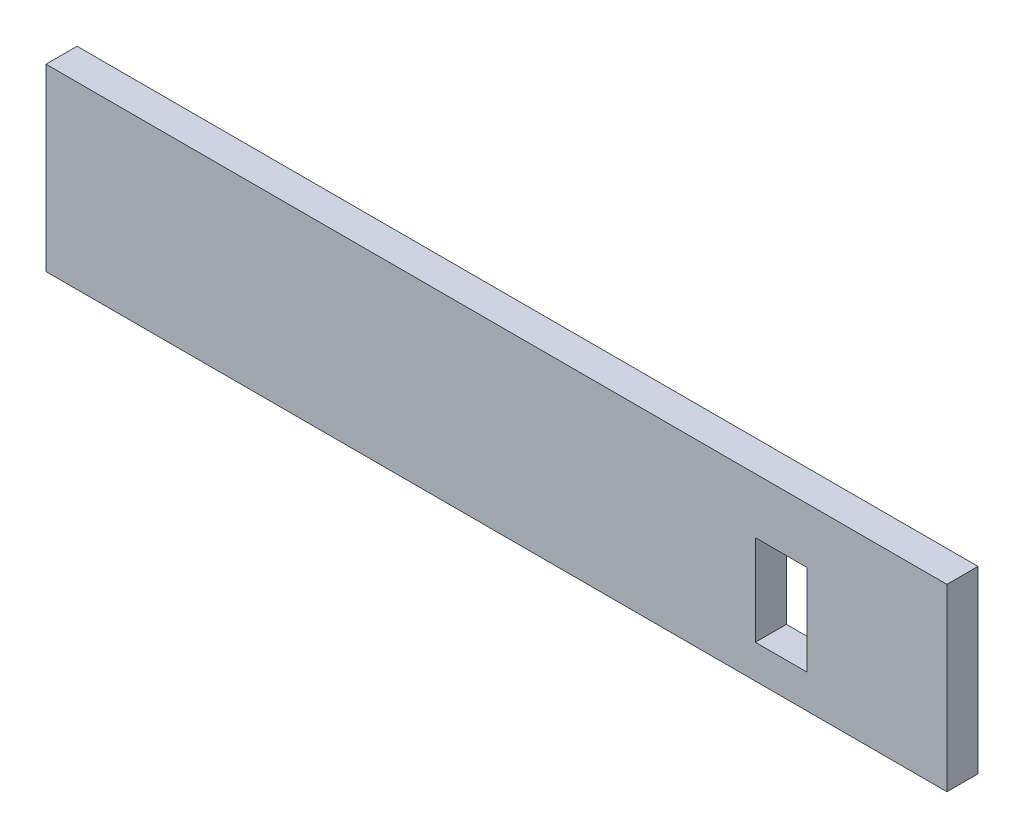
ISO-10303-21;
HEADER;
FILE_DESCRIPTION(('STEP AP214'),'2;1');
FILE_NAME('part.step','',(''),(''),'','','');
FILE_SCHEMA(('AUTOMOTIVE_DESIGN { 1 0 10303 214 1 1 1 1 }'));
ENDSEC;
DATA;
#1=APPLICATION_CONTEXT('core data for automotive mechanical design processes');
#2=APPLICATION_PROTOCOL_DEFINITION('international standard','automotive_design',2000,#1);
#3=PRODUCT_CONTEXT('',#1,'mechanical');
#4=PRODUCT('Part','Part','',(#3));
#5=PRODUCT_RELATED_PRODUCT_CATEGORY('part','',(#4));
#6=PRODUCT_DEFINITION_FORMATION('','',#4);
#7=PRODUCT_DEFINITION_CONTEXT('part definition',#1,'design');
#8=PRODUCT_DEFINITION('design','',#6,#7);
#9=PRODUCT_DEFINITION_SHAPE('','',#8);
#10=(LENGTH_UNIT() NAMED_UNIT(*) SI_UNIT(.MILLI.,.METRE.));
#11=(NAMED_UNIT(*) PLANE_ANGLE_UNIT() SI_UNIT($,.RADIAN.));
#12=(NAMED_UNIT(*) SI_UNIT($,.STERADIAN.) SOLID_ANGLE_UNIT());
#13=UNCERTAINTY_MEASURE_WITH_UNIT(LENGTH_MEASURE(1.E-05),#10,'distance_accuracy_value','');
#14=(GEOMETRIC_REPRESENTATION_CONTEXT(3) GLOBAL_UNCERTAINTY_ASSIGNED_CONTEXT((#13)) GLOBAL_UNIT_ASSIGNED_CONTEXT((#10,
#11,#12)) REPRESENTATION_CONTEXT('',''));
#15=CARTESIAN_POINT('',(0.,0.,0.));
#16=DIRECTION('',(0.,0.,1.));
#17=DIRECTION('',(1.,0.,0.));
#18=AXIS2_PLACEMENT_3D('',#15,#16,#17);
#19=CARTESIAN_POINT('',(276.225,-55.07228,19.05));
#20=DIRECTION('',(-1.,0.,0.));
#21=DIRECTION('',(0.,0.,1.));
#22=AXIS2_PLACEMENT_3D('',#19,#20,#21);
#23=PLANE('',#22);
#24=DIRECTION('',(0.,1.,0.));
#25=VECTOR('',#24,1.);
#26=CARTESIAN_POINT('',(276.225,-55.07228,0.));
#27=LINE('',#26,#25);
#28=CARTESIAN_POINT('',(276.225,-55.07228,0.));
#29=VERTEX_POINT('',#28);
#30=CARTESIAN_POINT('',(276.225,55.07228,0.));
#31=VERTEX_POINT('',#30);
#32=EDGE_CURVE('E130',#29,#31,#27,.T.);
#33=ORIENTED_EDGE('',*,*,#32,.T.);
#34=DIRECTION('',(0.,0.,-1.));
#35=VECTOR('',#34,1.);
#36=CARTESIAN_POINT('',(276.225,55.07228,19.05));
#37=LINE('',#36,#35);
#38=CARTESIAN_POINT('',(276.225,55.07228,19.05));
#39=VERTEX_POINT('',#38);
#40=EDGE_CURVE('E11',#39,#31,#37,.T.);
#41=ORIENTED_EDGE('',*,*,#40,.F.);
#42=DIRECTION('',(0.,1.,0.));
#43=VECTOR('',#42,1.);
#44=CARTESIAN_POINT('',(276.225,-55.07228,19.05));
#45=LINE('',#44,#43);
#46=CARTESIAN_POINT('',(276.225,-55.07228,19.05));
#47=VERTEX_POINT('',#46);
#48=EDGE_CURVE('E134',#47,#39,#45,.T.);
#49=ORIENTED_EDGE('',*,*,#48,.F.);
#50=DIRECTION('',(0.,0.,-1.));
#51=VECTOR('',#50,1.);
#52=CARTESIAN_POINT('',(276.225,-55.07228,19.05));
#53=LINE('',#52,#51);
#54=EDGE_CURVE('E144',#47,#29,#53,.T.);
#55=ORIENTED_EDGE('',*,*,#54,.T.);
#56=EDGE_LOOP('',(#33,#41,#49,#55));
#57=FACE_BOUND('',#56,.T.);
#58=ADVANCED_FACE('F33',(#57),#23,.F.);
#59=CARTESIAN_POINT('',(-276.225,55.07228,19.05));
#60=DIRECTION('',(0.,-1.,0.));
#61=DIRECTION('',(0.,0.,-1.));
#62=AXIS2_PLACEMENT_3D('',#59,#60,#61);
#63=PLANE('',#62);
#64=DIRECTION('',(-1.,0.,0.));
#65=VECTOR('',#64,1.);
#66=CARTESIAN_POINT('',(-276.225,55.07228,0.));
#67=LINE('',#66,#65);
#68=CARTESIAN_POINT('',(-276.225,55.07228,0.));
#69=VERTEX_POINT('',#68);
#70=EDGE_CURVE('E147',#31,#69,#67,.T.);
#71=ORIENTED_EDGE('',*,*,#70,.T.);
#72=DIRECTION('',(0.,0.,-1.));
#73=VECTOR('',#72,1.);
#74=CARTESIAN_POINT('',(-276.225,55.07228,19.05));
#75=LINE('',#74,#73);
#76=CARTESIAN_POINT('',(-276.225,55.07228,19.05));
#77=VERTEX_POINT('',#76);
#78=EDGE_CURVE('E40',#77,#69,#75,.T.);
#79=ORIENTED_EDGE('',*,*,#78,.F.);
#80=DIRECTION('',(-1.,0.,0.));
#81=VECTOR('',#80,1.);
#82=CARTESIAN_POINT('',(-276.225,55.07228,19.05));
#83=LINE('',#82,#81);
#84=EDGE_CURVE('E137',#39,#77,#83,.T.);
#85=ORIENTED_EDGE('',*,*,#84,.F.);
#86=ORIENTED_EDGE('',*,*,#40,.T.);
#87=EDGE_LOOP('',(#71,#79,#85,#86));
#88=FACE_BOUND('',#87,.T.);
#89=ADVANCED_FACE('F175',(#88),#63,.F.);
#90=CARTESIAN_POINT('',(-276.225,-55.07228,19.05));
#91=DIRECTION('',(1.,0.,0.));
#92=DIRECTION('',(0.,0.,-1.));
#93=AXIS2_PLACEMENT_3D('',#90,#91,#92);
#94=PLANE('',#93);
#95=DIRECTION('',(0.,-1.,0.));
#96=VECTOR('',#95,1.);
#97=CARTESIAN_POINT('',(-276.225,-55.07228,0.));
#98=LINE('',#97,#96);
#99=CARTESIAN_POINT('',(-276.225,-55.07228,0.));
#100=VERTEX_POINT('',#99);
#101=EDGE_CURVE('E149',#69,#100,#98,.T.);
#102=ORIENTED_EDGE('',*,*,#101,.T.);
#103=DIRECTION('',(0.,0.,-1.));
#104=VECTOR('',#103,1.);
#105=CARTESIAN_POINT('',(-276.225,-55.07228,19.05));
#106=LINE('',#105,#104);
#107=CARTESIAN_POINT('',(-276.225,-55.07228,19.05));
#108=VERTEX_POINT('',#107);
#109=EDGE_CURVE('E154',#108,#100,#106,.T.);
#110=ORIENTED_EDGE('',*,*,#109,.F.);
#111=DIRECTION('',(0.,-1.,0.));
#112=VECTOR('',#111,1.);
#113=CARTESIAN_POINT('',(-276.225,-55.07228,19.05));
#114=LINE('',#113,#112);
#115=EDGE_CURVE('E140',#77,#108,#114,.T.);
#116=ORIENTED_EDGE('',*,*,#115,.F.);
#117=ORIENTED_EDGE('',*,*,#78,.T.);
#118=EDGE_LOOP('',(#102,#110,#116,#117));
#119=FACE_BOUND('',#118,.T.);
#120=ADVANCED_FACE('F161',(#119),#94,.F.);
#121=CARTESIAN_POINT('',(-276.225,-55.07228,19.05));
#122=DIRECTION('',(0.,1.,0.));
#123=DIRECTION('',(0.,0.,1.));
#124=AXIS2_PLACEMENT_3D('',#121,#122,#123);
#125=PLANE('',#124);
#126=DIRECTION('',(1.,0.,0.));
#127=VECTOR('',#126,1.);
#128=CARTESIAN_POINT('',(-276.225,-55.07228,0.));
#129=LINE('',#128,#127);
#130=EDGE_CURVE('E138',#100,#29,#129,.T.);
#131=ORIENTED_EDGE('',*,*,#130,.T.);
#132=ORIENTED_EDGE('',*,*,#54,.F.);
#133=DIRECTION('',(1.,0.,0.));
#134=VECTOR('',#133,1.);
#135=CARTESIAN_POINT('',(-276.225,-55.07228,19.05));
#136=LINE('',#135,#134);
#137=EDGE_CURVE('E142',#108,#47,#136,.T.);
#138=ORIENTED_EDGE('',*,*,#137,.F.);
#139=ORIENTED_EDGE('',*,*,#109,.T.);
#140=EDGE_LOOP('',(#131,#132,#138,#139));
#141=FACE_BOUND('',#140,.T.);
#142=ADVANCED_FACE('F170',(#141),#125,.F.);
#143=CARTESIAN_POINT('',(0.,0.,19.05));
#144=DIRECTION('',(0.,0.,-1.));
#145=DIRECTION('',(-1.,0.,0.));
#146=AXIS2_PLACEMENT_3D('',#143,#144,#145);
#147=PLANE('',#146);
#148=DIRECTION('',(1.,0.,0.));
#149=VECTOR('',#148,1.);
#150=CARTESIAN_POINT('',(190.5,21.12772,19.05));
#151=LINE('',#150,#149);
#152=CARTESIAN_POINT('',(158.75,21.12772,19.05));
#153=VERTEX_POINT('',#152);
#154=CARTESIAN_POINT('',(190.5,21.12772,19.05));
#155=VERTEX_POINT('',#154);
#156=EDGE_CURVE('E105',#153,#155,#151,.T.);
#157=ORIENTED_EDGE('',*,*,#156,.T.);
#158=DIRECTION('',(0.,-1.,0.));
#159=VECTOR('',#158,1.);
#160=CARTESIAN_POINT('',(190.5,21.12772,19.05));
#161=LINE('',#160,#159);
#162=CARTESIAN_POINT('',(190.5,-34.43478,19.05));
#163=VERTEX_POINT('',#162);
#164=EDGE_CURVE('E99',#155,#163,#161,.T.);
#165=ORIENTED_EDGE('',*,*,#164,.T.);
#166=DIRECTION('',(-1.,0.,0.));
#167=VECTOR('',#166,1.);
#168=CARTESIAN_POINT('',(190.5,-34.43478,19.05));
#169=LINE('',#168,#167);
#170=CARTESIAN_POINT('',(158.75,-34.43478,19.05));
#171=VERTEX_POINT('',#170);
#172=EDGE_CURVE('E108',#163,#171,#169,.T.);
#173=ORIENTED_EDGE('',*,*,#172,.T.);
#174=DIRECTION('',(0.,1.,0.));
#175=VECTOR('',#174,1.);
#176=CARTESIAN_POINT('',(158.75,21.12772,19.05));
#177=LINE('',#176,#175);
#178=EDGE_CURVE('E47',#171,#153,#177,.T.);
#179=ORIENTED_EDGE('',*,*,#178,.T.);
#180=EDGE_LOOP('',(#157,#165,#173,#179));
#181=FACE_BOUND('',#180,.T.);
#182=ORIENTED_EDGE('',*,*,#48,.T.);
#183=ORIENTED_EDGE('',*,*,#84,.T.);
#184=ORIENTED_EDGE('',*,*,#115,.T.);
#185=ORIENTED_EDGE('',*,*,#137,.T.);
#186=EDGE_LOOP('',(#182,#183,#184,#185));
#187=FACE_BOUND('',#186,.T.);
#188=ADVANCED_FACE('F112',(#181,#187),#147,.F.);
#189=CARTESIAN_POINT('',(0.,0.,0.));
#190=DIRECTION('',(0.,0.,-1.));
#191=DIRECTION('',(-1.,0.,0.));
#192=AXIS2_PLACEMENT_3D('',#189,#190,#191);
#193=PLANE('',#192);
#194=DIRECTION('',(0.,-1.,0.));
#195=VECTOR('',#194,1.);
#196=CARTESIAN_POINT('',(190.5,21.12772,0.));
#197=LINE('',#196,#195);
#198=CARTESIAN_POINT('',(190.5,21.12772,0.));
#199=VERTEX_POINT('',#198);
#200=CARTESIAN_POINT('',(190.5,-34.43478,0.));
#201=VERTEX_POINT('',#200);
#202=EDGE_CURVE('E55',#199,#201,#197,.T.);
#203=ORIENTED_EDGE('',*,*,#202,.F.);
#204=DIRECTION('',(1.,0.,0.));
#205=VECTOR('',#204,1.);
#206=CARTESIAN_POINT('',(190.5,21.12772,0.));
#207=LINE('',#206,#205);
#208=CARTESIAN_POINT('',(158.75,21.12772,0.));
#209=VERTEX_POINT('',#208);
#210=EDGE_CURVE('E115',#209,#199,#207,.T.);
#211=ORIENTED_EDGE('',*,*,#210,.F.);
#212=DIRECTION('',(0.,1.,0.));
#213=VECTOR('',#212,1.);
#214=CARTESIAN_POINT('',(158.75,21.12772,0.));
#215=LINE('',#214,#213);
#216=CARTESIAN_POINT('',(158.75,-34.43478,0.));
#217=VERTEX_POINT('',#216);
#218=EDGE_CURVE('E118',#217,#209,#215,.T.);
#219=ORIENTED_EDGE('',*,*,#218,.F.);
#220=DIRECTION('',(-1.,0.,0.));
#221=VECTOR('',#220,1.);
#222=CARTESIAN_POINT('',(190.5,-34.43478,0.));
#223=LINE('',#222,#221);
#224=EDGE_CURVE('E124',#201,#217,#223,.T.);
#225=ORIENTED_EDGE('',*,*,#224,.F.);
#226=EDGE_LOOP('',(#203,#211,#219,#225));
#227=FACE_BOUND('',#226,.T.);
#228=ORIENTED_EDGE('',*,*,#32,.F.);
#229=ORIENTED_EDGE('',*,*,#130,.F.);
#230=ORIENTED_EDGE('',*,*,#101,.F.);
#231=ORIENTED_EDGE('',*,*,#70,.F.);
#232=EDGE_LOOP('',(#228,#229,#230,#231));
#233=FACE_BOUND('',#232,.T.);
#234=ADVANCED_FACE('F167',(#227,#233),#193,.T.);
#235=CARTESIAN_POINT('',(190.5,21.12772,19.05));
#236=DIRECTION('',(1.,0.,0.));
#237=DIRECTION('',(0.,0.,-1.));
#238=AXIS2_PLACEMENT_3D('',#235,#236,#237);
#239=PLANE('',#238);
#240=ORIENTED_EDGE('',*,*,#202,.T.);
#241=DIRECTION('',(0.,0.,-1.));
#242=VECTOR('',#241,1.);
#243=CARTESIAN_POINT('',(190.5,-34.43478,19.05));
#244=LINE('',#243,#242);
#245=EDGE_CURVE('E95',#163,#201,#244,.T.);
#246=ORIENTED_EDGE('',*,*,#245,.F.);
#247=ORIENTED_EDGE('',*,*,#164,.F.);
#248=DIRECTION('',(0.,0.,-1.));
#249=VECTOR('',#248,1.);
#250=CARTESIAN_POINT('',(190.5,21.12772,19.05));
#251=LINE('',#250,#249);
#252=EDGE_CURVE('E128',#155,#199,#251,.T.);
#253=ORIENTED_EDGE('',*,*,#252,.T.);
#254=EDGE_LOOP('',(#240,#246,#247,#253));
#255=FACE_BOUND('',#254,.T.);
#256=ADVANCED_FACE('F97',(#255),#239,.F.);
#257=CARTESIAN_POINT('',(190.5,21.12772,19.05));
#258=DIRECTION('',(0.,1.,0.));
#259=DIRECTION('',(0.,0.,1.));
#260=AXIS2_PLACEMENT_3D('',#257,#258,#259);
#261=PLANE('',#260);
#262=ORIENTED_EDGE('',*,*,#210,.T.);
#263=ORIENTED_EDGE('',*,*,#252,.F.);
#264=ORIENTED_EDGE('',*,*,#156,.F.);
#265=DIRECTION('',(0.,0.,-1.));
#266=VECTOR('',#265,1.);
#267=CARTESIAN_POINT('',(158.75,21.12772,19.05));
#268=LINE('',#267,#266);
#269=EDGE_CURVE('E131',#153,#209,#268,.T.);
#270=ORIENTED_EDGE('',*,*,#269,.T.);
#271=EDGE_LOOP('',(#262,#263,#264,#270));
#272=FACE_BOUND('',#271,.T.);
#273=ADVANCED_FACE('F192',(#272),#261,.F.);
#274=CARTESIAN_POINT('',(158.75,21.12772,19.05));
#275=DIRECTION('',(-1.,0.,0.));
#276=DIRECTION('',(0.,0.,1.));
#277=AXIS2_PLACEMENT_3D('',#274,#275,#276);
#278=PLANE('',#277);
#279=ORIENTED_EDGE('',*,*,#218,.T.);
#280=ORIENTED_EDGE('',*,*,#269,.F.);
#281=ORIENTED_EDGE('',*,*,#178,.F.);
#282=DIRECTION('',(0.,0.,-1.));
#283=VECTOR('',#282,1.);
#284=CARTESIAN_POINT('',(158.75,-34.43478,19.05));
#285=LINE('',#284,#283);
#286=EDGE_CURVE('E104',#171,#217,#285,.T.);
#287=ORIENTED_EDGE('',*,*,#286,.T.);
#288=EDGE_LOOP('',(#279,#280,#281,#287));
#289=FACE_BOUND('',#288,.T.);
#290=ADVANCED_FACE('F195',(#289),#278,.F.);
#291=CARTESIAN_POINT('',(190.5,-34.43478,19.05));
#292=DIRECTION('',(0.,-1.,0.));
#293=DIRECTION('',(0.,0.,-1.));
#294=AXIS2_PLACEMENT_3D('',#291,#292,#293);
#295=PLANE('',#294);
#296=ORIENTED_EDGE('',*,*,#224,.T.);
#297=ORIENTED_EDGE('',*,*,#286,.F.);
#298=ORIENTED_EDGE('',*,*,#172,.F.);
#299=ORIENTED_EDGE('',*,*,#245,.T.);
#300=EDGE_LOOP('',(#296,#297,#298,#299));
#301=FACE_BOUND('',#300,.T.);
#302=ADVANCED_FACE('F109',(#301),#295,.F.);
#303=CLOSED_SHELL('',(#58,#89,#120,#142,#188,#234,#256,#273,#290,#302));
#304=MANIFOLD_SOLID_BREP('B2',#303);
#305=ADVANCED_BREP_SHAPE_REPRESENTATION('',(#18,#304),#14);
#306=SHAPE_DEFINITION_REPRESENTATION(#9,#305);
ENDSEC;
END-ISO-10303-21;
